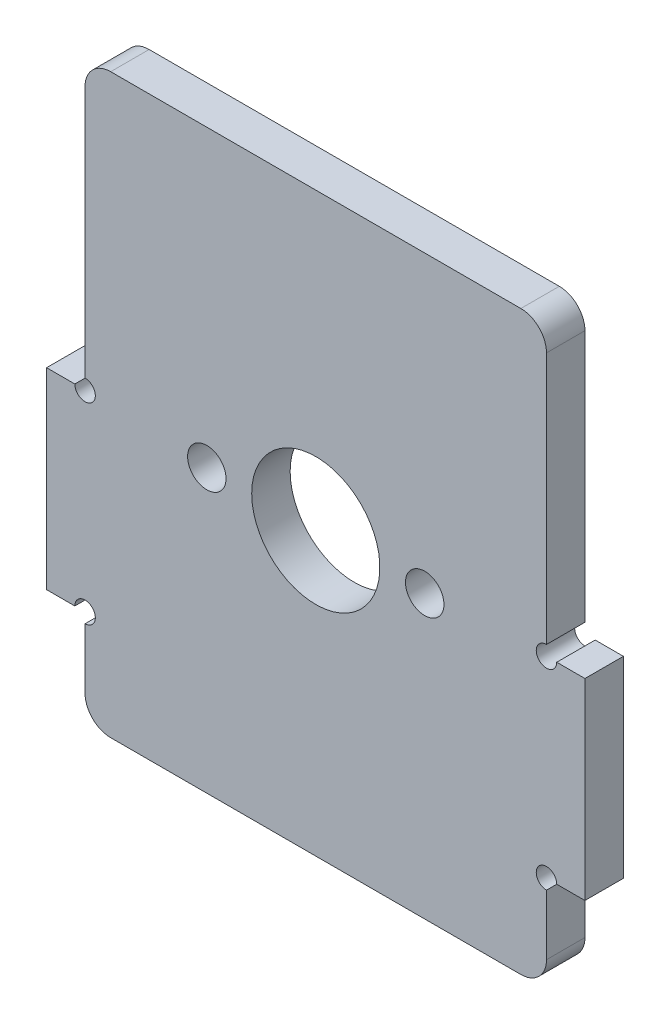
ISO-10303-21;
HEADER;
FILE_DESCRIPTION(('STEP AP214'),'2;1');
FILE_NAME('part.step','',(''),(''),'','','');
FILE_SCHEMA(('AUTOMOTIVE_DESIGN { 1 0 10303 214 1 1 1 1 }'));
ENDSEC;
DATA;
#1=APPLICATION_CONTEXT('core data for automotive mechanical design processes');
#2=APPLICATION_PROTOCOL_DEFINITION('international standard','automotive_design',2000,#1);
#3=PRODUCT_CONTEXT('',#1,'mechanical');
#4=PRODUCT('Part','Part','',(#3));
#5=PRODUCT_RELATED_PRODUCT_CATEGORY('part','',(#4));
#6=PRODUCT_DEFINITION_FORMATION('','',#4);
#7=PRODUCT_DEFINITION_CONTEXT('part definition',#1,'design');
#8=PRODUCT_DEFINITION('design','',#6,#7);
#9=PRODUCT_DEFINITION_SHAPE('','',#8);
#10=(LENGTH_UNIT() NAMED_UNIT(*) SI_UNIT(.MILLI.,.METRE.));
#11=(NAMED_UNIT(*) PLANE_ANGLE_UNIT() SI_UNIT($,.RADIAN.));
#12=(NAMED_UNIT(*) SI_UNIT($,.STERADIAN.) SOLID_ANGLE_UNIT());
#13=UNCERTAINTY_MEASURE_WITH_UNIT(LENGTH_MEASURE(1.E-05),#10,'distance_accuracy_value','');
#14=(GEOMETRIC_REPRESENTATION_CONTEXT(3) GLOBAL_UNCERTAINTY_ASSIGNED_CONTEXT((#13)) GLOBAL_UNIT_ASSIGNED_CONTEXT((#10,
#11,#12)) REPRESENTATION_CONTEXT('',''));
#15=CARTESIAN_POINT('',(0.,0.,0.));
#16=DIRECTION('',(0.,0.,1.));
#17=DIRECTION('',(1.,0.,0.));
#18=AXIS2_PLACEMENT_3D('',#15,#16,#17);
#19=CARTESIAN_POINT('',(-18.,0.,3.));
#20=DIRECTION('',(-1.,0.,0.));
#21=DIRECTION('',(0.,-1.,0.));
#22=AXIS2_PLACEMENT_3D('',#19,#20,#21);
#23=PLANE('',#22);
#24=DIRECTION('',(0.,1.,0.));
#25=VECTOR('',#24,1.);
#26=CARTESIAN_POINT('',(-18.,0.,3.));
#27=LINE('',#26,#25);
#28=CARTESIAN_POINT('',(-18.,8.29999999999999,3.));
#29=VERTEX_POINT('',#28);
#30=CARTESIAN_POINT('',(-18.,28.,3.));
#31=VERTEX_POINT('',#30);
#32=EDGE_CURVE('E220',#29,#31,#27,.T.);
#33=ORIENTED_EDGE('',*,*,#32,.T.);
#34=DIRECTION('',(0.,0.,-1.));
#35=VECTOR('',#34,1.);
#36=CARTESIAN_POINT('',(-18.,28.,3.));
#37=LINE('',#36,#35);
#38=CARTESIAN_POINT('',(-18.,28.,0.));
#39=VERTEX_POINT('',#38);
#40=EDGE_CURVE('E353',#31,#39,#37,.T.);
#41=ORIENTED_EDGE('',*,*,#40,.T.);
#42=DIRECTION('',(0.,1.,0.));
#43=VECTOR('',#42,1.);
#44=CARTESIAN_POINT('',(-18.,0.,0.));
#45=LINE('',#44,#43);
#46=CARTESIAN_POINT('',(-18.,8.29999999999999,0.));
#47=VERTEX_POINT('',#46);
#48=EDGE_CURVE('E234',#47,#39,#45,.T.);
#49=ORIENTED_EDGE('',*,*,#48,.F.);
#50=DIRECTION('',(0.,0.,-1.));
#51=VECTOR('',#50,1.);
#52=CARTESIAN_POINT('',(-18.,8.29999999999999,3.));
#53=LINE('',#52,#51);
#54=EDGE_CURVE('E261',#29,#47,#53,.T.);
#55=ORIENTED_EDGE('',*,*,#54,.F.);
#56=EDGE_LOOP('',(#33,#41,#49,#55));
#57=FACE_BOUND('',#56,.T.);
#58=ADVANCED_FACE('F35',(#57),#23,.T.);
#59=CARTESIAN_POINT('',(0.,7.49999999999999,3.));
#60=DIRECTION('',(0.,1.,0.));
#61=DIRECTION('',(0.,0.,1.));
#62=AXIS2_PLACEMENT_3D('',#59,#60,#61);
#63=PLANE('',#62);
#64=DIRECTION('',(0.,0.,-1.));
#65=VECTOR('',#64,1.);
#66=CARTESIAN_POINT('',(-18.8,7.49999999999999,3.));
#67=LINE('',#66,#65);
#68=CARTESIAN_POINT('',(-18.8,7.49999999999999,0.));
#69=VERTEX_POINT('',#68);
#70=CARTESIAN_POINT('',(-18.8,7.49999999999999,3.));
#71=VERTEX_POINT('',#70);
#72=EDGE_CURVE('E263',#69,#71,#67,.F.);
#73=ORIENTED_EDGE('',*,*,#72,.F.);
#74=DIRECTION('',(1.,0.,0.));
#75=VECTOR('',#74,1.);
#76=CARTESIAN_POINT('',(0.,7.49999999999999,0.));
#77=LINE('',#76,#75);
#78=CARTESIAN_POINT('',(-21.,7.49999999999999,0.));
#79=VERTEX_POINT('',#78);
#80=EDGE_CURVE('E302',#79,#69,#77,.T.);
#81=ORIENTED_EDGE('',*,*,#80,.F.);
#82=DIRECTION('',(0.,0.,-1.));
#83=VECTOR('',#82,1.);
#84=CARTESIAN_POINT('',(-21.,7.49999999999999,3.));
#85=LINE('',#84,#83);
#86=CARTESIAN_POINT('',(-21.,7.49999999999999,3.));
#87=VERTEX_POINT('',#86);
#88=EDGE_CURVE('E320',#87,#79,#85,.T.);
#89=ORIENTED_EDGE('',*,*,#88,.F.);
#90=DIRECTION('',(1.,0.,0.));
#91=VECTOR('',#90,1.);
#92=CARTESIAN_POINT('',(0.,7.49999999999999,3.));
#93=LINE('',#92,#91);
#94=EDGE_CURVE('E227',#87,#71,#93,.T.);
#95=ORIENTED_EDGE('',*,*,#94,.T.);
#96=EDGE_LOOP('',(#73,#81,#89,#95));
#97=FACE_BOUND('',#96,.T.);
#98=ADVANCED_FACE('F390',(#97),#63,.T.);
#99=CARTESIAN_POINT('',(-21.,0.,3.));
#100=DIRECTION('',(-1.,0.,0.));
#101=DIRECTION('',(0.,0.,1.));
#102=AXIS2_PLACEMENT_3D('',#99,#100,#101);
#103=PLANE('',#102);
#104=DIRECTION('',(0.,1.,0.));
#105=VECTOR('',#104,1.);
#106=CARTESIAN_POINT('',(-21.,0.,0.));
#107=LINE('',#106,#105);
#108=CARTESIAN_POINT('',(-21.,-7.50000000000001,0.));
#109=VERTEX_POINT('',#108);
#110=EDGE_CURVE('E298',#109,#79,#107,.T.);
#111=ORIENTED_EDGE('',*,*,#110,.F.);
#112=DIRECTION('',(0.,0.,-1.));
#113=VECTOR('',#112,1.);
#114=CARTESIAN_POINT('',(-21.,-7.50000000000001,3.));
#115=LINE('',#114,#113);
#116=CARTESIAN_POINT('',(-21.,-7.50000000000001,3.));
#117=VERTEX_POINT('',#116);
#118=EDGE_CURVE('E293',#117,#109,#115,.T.);
#119=ORIENTED_EDGE('',*,*,#118,.F.);
#120=DIRECTION('',(0.,1.,0.));
#121=VECTOR('',#120,1.);
#122=CARTESIAN_POINT('',(-21.,0.,3.));
#123=LINE('',#122,#121);
#124=EDGE_CURVE('E224',#117,#87,#123,.T.);
#125=ORIENTED_EDGE('',*,*,#124,.T.);
#126=ORIENTED_EDGE('',*,*,#88,.T.);
#127=EDGE_LOOP('',(#111,#119,#125,#126));
#128=FACE_BOUND('',#127,.T.);
#129=ADVANCED_FACE('F398',(#128),#103,.T.);
#130=CARTESIAN_POINT('',(0.,-7.50000000000001,3.));
#131=DIRECTION('',(0.,1.,0.));
#132=DIRECTION('',(0.,0.,1.));
#133=AXIS2_PLACEMENT_3D('',#130,#131,#132);
#134=PLANE('',#133);
#135=DIRECTION('',(1.,0.,0.));
#136=VECTOR('',#135,1.);
#137=CARTESIAN_POINT('',(0.,-7.50000000000001,0.));
#138=LINE('',#137,#136);
#139=CARTESIAN_POINT('',(-18.8,-7.50000000000001,0.));
#140=VERTEX_POINT('',#139);
#141=EDGE_CURVE('E292',#109,#140,#138,.T.);
#142=ORIENTED_EDGE('',*,*,#141,.T.);
#143=DIRECTION('',(0.,0.,-1.));
#144=VECTOR('',#143,1.);
#145=CARTESIAN_POINT('',(-18.8,-7.50000000000001,3.));
#146=LINE('',#145,#144);
#147=CARTESIAN_POINT('',(-18.8,-7.50000000000001,3.));
#148=VERTEX_POINT('',#147);
#149=EDGE_CURVE('E265',#140,#148,#146,.F.);
#150=ORIENTED_EDGE('',*,*,#149,.T.);
#151=DIRECTION('',(1.,0.,0.));
#152=VECTOR('',#151,1.);
#153=CARTESIAN_POINT('',(0.,-7.50000000000001,3.));
#154=LINE('',#153,#152);
#155=EDGE_CURVE('E218',#117,#148,#154,.T.);
#156=ORIENTED_EDGE('',*,*,#155,.F.);
#157=ORIENTED_EDGE('',*,*,#118,.T.);
#158=EDGE_LOOP('',(#142,#150,#156,#157));
#159=FACE_BOUND('',#158,.T.);
#160=ADVANCED_FACE('F290',(#159),#134,.F.);
#161=CARTESIAN_POINT('',(-18.,-13.,0.));
#162=VERTEX_POINT('',#161);
#163=CARTESIAN_POINT('',(-18.,-8.30000000000001,0.));
#164=VERTEX_POINT('',#163);
#165=EDGE_CURVE('E297',#162,#164,#45,.T.);
#166=ORIENTED_EDGE('',*,*,#165,.F.);
#167=DIRECTION('',(0.,0.,-1.));
#168=VECTOR('',#167,1.);
#169=CARTESIAN_POINT('',(-18.,-13.,3.));
#170=LINE('',#169,#168);
#171=CARTESIAN_POINT('',(-18.,-13.,3.));
#172=VERTEX_POINT('',#171);
#173=EDGE_CURVE('E50',#162,#172,#170,.F.);
#174=ORIENTED_EDGE('',*,*,#173,.T.);
#175=CARTESIAN_POINT('',(-18.,-8.30000000000001,3.));
#176=VERTEX_POINT('',#175);
#177=EDGE_CURVE('E215',#172,#176,#27,.T.);
#178=ORIENTED_EDGE('',*,*,#177,.T.);
#179=DIRECTION('',(0.,0.,-1.));
#180=VECTOR('',#179,1.);
#181=CARTESIAN_POINT('',(-18.,-8.30000000000001,3.));
#182=LINE('',#181,#180);
#183=EDGE_CURVE('E268',#164,#176,#182,.F.);
#184=ORIENTED_EDGE('',*,*,#183,.F.);
#185=EDGE_LOOP('',(#166,#174,#178,#184));
#186=FACE_BOUND('',#185,.T.);
#187=ADVANCED_FACE('F392',(#186),#23,.T.);
#188=CARTESIAN_POINT('',(0.,-15.,3.));
#189=DIRECTION('',(0.,1.,0.));
#190=DIRECTION('',(0.,0.,1.));
#191=AXIS2_PLACEMENT_3D('',#188,#189,#190);
#192=PLANE('',#191);
#193=DIRECTION('',(1.,0.,0.));
#194=VECTOR('',#193,1.);
#195=CARTESIAN_POINT('',(0.,-15.,0.));
#196=LINE('',#195,#194);
#197=CARTESIAN_POINT('',(-16.,-15.,0.));
#198=VERTEX_POINT('',#197);
#199=CARTESIAN_POINT('',(16.,-15.,0.));
#200=VERTEX_POINT('',#199);
#201=EDGE_CURVE('E300',#198,#200,#196,.T.);
#202=ORIENTED_EDGE('',*,*,#201,.T.);
#203=DIRECTION('',(0.,0.,-1.));
#204=VECTOR('',#203,1.);
#205=CARTESIAN_POINT('',(16.,-15.,3.));
#206=LINE('',#205,#204);
#207=CARTESIAN_POINT('',(16.,-15.,3.));
#208=VERTEX_POINT('',#207);
#209=EDGE_CURVE('E343',#200,#208,#206,.F.);
#210=ORIENTED_EDGE('',*,*,#209,.T.);
#211=DIRECTION('',(1.,0.,0.));
#212=VECTOR('',#211,1.);
#213=CARTESIAN_POINT('',(0.,-15.,3.));
#214=LINE('',#213,#212);
#215=CARTESIAN_POINT('',(-16.,-15.,3.));
#216=VERTEX_POINT('',#215);
#217=EDGE_CURVE('E210',#216,#208,#214,.T.);
#218=ORIENTED_EDGE('',*,*,#217,.F.);
#219=DIRECTION('',(0.,0.,-1.));
#220=VECTOR('',#219,1.);
#221=CARTESIAN_POINT('',(-16.,-15.,0.));
#222=LINE('',#221,#220);
#223=EDGE_CURVE('E340',#216,#198,#222,.T.);
#224=ORIENTED_EDGE('',*,*,#223,.T.);
#225=EDGE_LOOP('',(#202,#210,#218,#224));
#226=FACE_BOUND('',#225,.T.);
#227=ADVANCED_FACE('F403',(#226),#192,.F.);
#228=CARTESIAN_POINT('',(18.,0.,3.));
#229=DIRECTION('',(-1.,0.,0.));
#230=DIRECTION('',(0.,-1.,0.));
#231=AXIS2_PLACEMENT_3D('',#228,#229,#230);
#232=PLANE('',#231);
#233=DIRECTION('',(0.,1.,0.));
#234=VECTOR('',#233,1.);
#235=CARTESIAN_POINT('',(18.,0.,3.));
#236=LINE('',#235,#234);
#237=CARTESIAN_POINT('',(18.,-13.,3.));
#238=VERTEX_POINT('',#237);
#239=CARTESIAN_POINT('',(18.,-8.30000000000001,3.));
#240=VERTEX_POINT('',#239);
#241=EDGE_CURVE('E201',#238,#240,#236,.T.);
#242=ORIENTED_EDGE('',*,*,#241,.F.);
#243=DIRECTION('',(0.,0.,-1.));
#244=VECTOR('',#243,1.);
#245=CARTESIAN_POINT('',(18.,-13.,3.));
#246=LINE('',#245,#244);
#247=CARTESIAN_POINT('',(18.,-13.,0.));
#248=VERTEX_POINT('',#247);
#249=EDGE_CURVE('E329',#238,#248,#246,.T.);
#250=ORIENTED_EDGE('',*,*,#249,.T.);
#251=DIRECTION('',(0.,1.,0.));
#252=VECTOR('',#251,1.);
#253=CARTESIAN_POINT('',(18.,0.,0.));
#254=LINE('',#253,#252);
#255=CARTESIAN_POINT('',(18.,-8.30000000000001,0.));
#256=VERTEX_POINT('',#255);
#257=EDGE_CURVE('E308',#248,#256,#254,.T.);
#258=ORIENTED_EDGE('',*,*,#257,.T.);
#259=DIRECTION('',(0.,0.,-1.));
#260=VECTOR('',#259,1.);
#261=CARTESIAN_POINT('',(18.,-8.30000000000001,3.));
#262=LINE('',#261,#260);
#263=EDGE_CURVE('E243',#256,#240,#262,.F.);
#264=ORIENTED_EDGE('',*,*,#263,.T.);
#265=EDGE_LOOP('',(#242,#250,#258,#264));
#266=FACE_BOUND('',#265,.T.);
#267=ADVANCED_FACE('F407',(#266),#232,.F.);
#268=CARTESIAN_POINT('',(0.,-7.50000000000001,3.));
#269=DIRECTION('',(0.,-1.,0.));
#270=DIRECTION('',(0.,0.,-1.));
#271=AXIS2_PLACEMENT_3D('',#268,#269,#270);
#272=PLANE('',#271);
#273=DIRECTION('',(0.,0.,-1.));
#274=VECTOR('',#273,1.);
#275=CARTESIAN_POINT('',(18.8,-7.50000000000001,3.));
#276=LINE('',#275,#274);
#277=CARTESIAN_POINT('',(18.8,-7.50000000000001,0.));
#278=VERTEX_POINT('',#277);
#279=CARTESIAN_POINT('',(18.8,-7.50000000000001,3.));
#280=VERTEX_POINT('',#279);
#281=EDGE_CURVE('E259',#278,#280,#276,.F.);
#282=ORIENTED_EDGE('',*,*,#281,.F.);
#283=DIRECTION('',(-1.,0.,0.));
#284=VECTOR('',#283,1.);
#285=CARTESIAN_POINT('',(0.,-7.50000000000001,0.));
#286=LINE('',#285,#284);
#287=CARTESIAN_POINT('',(21.,-7.50000000000001,0.));
#288=VERTEX_POINT('',#287);
#289=EDGE_CURVE('E310',#288,#278,#286,.T.);
#290=ORIENTED_EDGE('',*,*,#289,.F.);
#291=DIRECTION('',(0.,0.,-1.));
#292=VECTOR('',#291,1.);
#293=CARTESIAN_POINT('',(21.,-7.50000000000001,3.));
#294=LINE('',#293,#292);
#295=CARTESIAN_POINT('',(21.,-7.50000000000001,3.));
#296=VERTEX_POINT('',#295);
#297=EDGE_CURVE('E203',#296,#288,#294,.T.);
#298=ORIENTED_EDGE('',*,*,#297,.F.);
#299=DIRECTION('',(-1.,0.,0.));
#300=VECTOR('',#299,1.);
#301=CARTESIAN_POINT('',(0.,-7.50000000000001,3.));
#302=LINE('',#301,#300);
#303=EDGE_CURVE('E209',#296,#280,#302,.T.);
#304=ORIENTED_EDGE('',*,*,#303,.T.);
#305=EDGE_LOOP('',(#282,#290,#298,#304));
#306=FACE_BOUND('',#305,.T.);
#307=ADVANCED_FACE('F424',(#306),#272,.T.);
#308=CARTESIAN_POINT('',(21.,0.,3.));
#309=DIRECTION('',(-1.,0.,0.));
#310=DIRECTION('',(0.,0.,1.));
#311=AXIS2_PLACEMENT_3D('',#308,#309,#310);
#312=PLANE('',#311);
#313=DIRECTION('',(0.,1.,0.));
#314=VECTOR('',#313,1.);
#315=CARTESIAN_POINT('',(21.,0.,0.));
#316=LINE('',#315,#314);
#317=CARTESIAN_POINT('',(21.,7.49999999999999,0.));
#318=VERTEX_POINT('',#317);
#319=EDGE_CURVE('E313',#288,#318,#316,.T.);
#320=ORIENTED_EDGE('',*,*,#319,.T.);
#321=DIRECTION('',(0.,0.,-1.));
#322=VECTOR('',#321,1.);
#323=CARTESIAN_POINT('',(21.,7.49999999999999,3.));
#324=LINE('',#323,#322);
#325=CARTESIAN_POINT('',(21.,7.49999999999999,3.));
#326=VERTEX_POINT('',#325);
#327=EDGE_CURVE('E199',#326,#318,#324,.T.);
#328=ORIENTED_EDGE('',*,*,#327,.F.);
#329=DIRECTION('',(0.,1.,0.));
#330=VECTOR('',#329,1.);
#331=CARTESIAN_POINT('',(21.,0.,3.));
#332=LINE('',#331,#330);
#333=EDGE_CURVE('E205',#296,#326,#332,.T.);
#334=ORIENTED_EDGE('',*,*,#333,.F.);
#335=ORIENTED_EDGE('',*,*,#297,.T.);
#336=EDGE_LOOP('',(#320,#328,#334,#335));
#337=FACE_BOUND('',#336,.T.);
#338=ADVANCED_FACE('F378',(#337),#312,.F.);
#339=CARTESIAN_POINT('',(0.,7.49999999999999,3.));
#340=DIRECTION('',(0.,-1.,0.));
#341=DIRECTION('',(0.,0.,-1.));
#342=AXIS2_PLACEMENT_3D('',#339,#340,#341);
#343=PLANE('',#342);
#344=DIRECTION('',(-1.,0.,0.));
#345=VECTOR('',#344,1.);
#346=CARTESIAN_POINT('',(0.,7.49999999999999,0.));
#347=LINE('',#346,#345);
#348=CARTESIAN_POINT('',(18.8,7.49999999999999,0.));
#349=VERTEX_POINT('',#348);
#350=EDGE_CURVE('E315',#318,#349,#347,.T.);
#351=ORIENTED_EDGE('',*,*,#350,.T.);
#352=DIRECTION('',(0.,0.,-1.));
#353=VECTOR('',#352,1.);
#354=CARTESIAN_POINT('',(18.8,7.49999999999999,3.));
#355=LINE('',#354,#353);
#356=CARTESIAN_POINT('',(18.8,7.49999999999999,3.));
#357=VERTEX_POINT('',#356);
#358=EDGE_CURVE('E184',#349,#357,#355,.F.);
#359=ORIENTED_EDGE('',*,*,#358,.T.);
#360=DIRECTION('',(-1.,0.,0.));
#361=VECTOR('',#360,1.);
#362=CARTESIAN_POINT('',(0.,7.49999999999999,3.));
#363=LINE('',#362,#361);
#364=EDGE_CURVE('E194',#326,#357,#363,.T.);
#365=ORIENTED_EDGE('',*,*,#364,.F.);
#366=ORIENTED_EDGE('',*,*,#327,.T.);
#367=EDGE_LOOP('',(#351,#359,#365,#366));
#368=FACE_BOUND('',#367,.T.);
#369=ADVANCED_FACE('F382',(#368),#343,.F.);
#370=CARTESIAN_POINT('',(18.,8.29999999999999,0.));
#371=VERTEX_POINT('',#370);
#372=CARTESIAN_POINT('',(18.,28.,0.));
#373=VERTEX_POINT('',#372);
#374=EDGE_CURVE('E230',#371,#373,#254,.T.);
#375=ORIENTED_EDGE('',*,*,#374,.T.);
#376=DIRECTION('',(0.,0.,-1.));
#377=VECTOR('',#376,1.);
#378=CARTESIAN_POINT('',(18.,28.,3.));
#379=LINE('',#378,#377);
#380=CARTESIAN_POINT('',(18.,28.,3.));
#381=VERTEX_POINT('',#380);
#382=EDGE_CURVE('E11',#373,#381,#379,.F.);
#383=ORIENTED_EDGE('',*,*,#382,.T.);
#384=CARTESIAN_POINT('',(18.,8.29999999999999,3.));
#385=VERTEX_POINT('',#384);
#386=EDGE_CURVE('E191',#385,#381,#236,.T.);
#387=ORIENTED_EDGE('',*,*,#386,.F.);
#388=DIRECTION('',(0.,0.,-1.));
#389=VECTOR('',#388,1.);
#390=CARTESIAN_POINT('',(18.,8.29999999999999,3.));
#391=LINE('',#390,#389);
#392=EDGE_CURVE('E173',#385,#371,#391,.T.);
#393=ORIENTED_EDGE('',*,*,#392,.T.);
#394=EDGE_LOOP('',(#375,#383,#387,#393));
#395=FACE_BOUND('',#394,.T.);
#396=ADVANCED_FACE('F197',(#395),#232,.F.);
#397=CARTESIAN_POINT('',(0.,0.,3.));
#398=DIRECTION('',(0.,0.,1.));
#399=DIRECTION('',(1.,0.,0.));
#400=AXIS2_PLACEMENT_3D('',#397,#398,#399);
#401=PLANE('',#400);
#402=ORIENTED_EDGE('',*,*,#217,.T.);
#403=CARTESIAN_POINT('',(16.,-13.,3.));
#404=DIRECTION('',(0.,0.,1.));
#405=DIRECTION('',(1.,0.,0.));
#406=AXIS2_PLACEMENT_3D('',#403,#404,#405);
#407=CIRCLE('',#406,2.);
#408=EDGE_CURVE('E350',#208,#238,#407,.T.);
#409=ORIENTED_EDGE('',*,*,#408,.T.);
#410=ORIENTED_EDGE('',*,*,#241,.T.);
#411=CARTESIAN_POINT('',(18.,-7.50000000000001,3.));
#412=DIRECTION('',(0.,0.,-1.));
#413=DIRECTION('',(-1.,0.,0.));
#414=AXIS2_PLACEMENT_3D('',#411,#412,#413);
#415=CIRCLE('',#414,0.799999999999999);
#416=EDGE_CURVE('E195',#240,#280,#415,.T.);
#417=ORIENTED_EDGE('',*,*,#416,.T.);
#418=ORIENTED_EDGE('',*,*,#303,.F.);
#419=ORIENTED_EDGE('',*,*,#333,.T.);
#420=ORIENTED_EDGE('',*,*,#364,.T.);
#421=CARTESIAN_POINT('',(18.,7.49999999999999,3.));
#422=DIRECTION('',(0.,0.,-1.));
#423=DIRECTION('',(-1.,0.,0.));
#424=AXIS2_PLACEMENT_3D('',#421,#422,#423);
#425=CIRCLE('',#424,0.799999999999999);
#426=EDGE_CURVE('E176',#357,#385,#425,.T.);
#427=ORIENTED_EDGE('',*,*,#426,.T.);
#428=ORIENTED_EDGE('',*,*,#386,.T.);
#429=CARTESIAN_POINT('',(16.,28.,3.));
#430=DIRECTION('',(0.,0.,1.));
#431=DIRECTION('',(1.,0.,0.));
#432=AXIS2_PLACEMENT_3D('',#429,#430,#431);
#433=CIRCLE('',#432,2.);
#434=CARTESIAN_POINT('',(16.,30.,3.));
#435=VERTEX_POINT('',#434);
#436=EDGE_CURVE('E345',#381,#435,#433,.T.);
#437=ORIENTED_EDGE('',*,*,#436,.T.);
#438=DIRECTION('',(1.,0.,0.));
#439=VECTOR('',#438,1.);
#440=CARTESIAN_POINT('',(18.,30.,3.));
#441=LINE('',#440,#439);
#442=CARTESIAN_POINT('',(-16.,30.,3.));
#443=VERTEX_POINT('',#442);
#444=EDGE_CURVE('E231',#443,#435,#441,.T.);
#445=ORIENTED_EDGE('',*,*,#444,.F.);
#446=CARTESIAN_POINT('',(-16.,28.,3.));
#447=DIRECTION('',(0.,0.,1.));
#448=DIRECTION('',(1.,0.,0.));
#449=AXIS2_PLACEMENT_3D('',#446,#447,#448);
#450=CIRCLE('',#449,2.);
#451=EDGE_CURVE('E58',#443,#31,#450,.T.);
#452=ORIENTED_EDGE('',*,*,#451,.T.);
#453=ORIENTED_EDGE('',*,*,#32,.F.);
#454=CARTESIAN_POINT('',(-18.,7.49999999999999,3.));
#455=DIRECTION('',(0.,0.,-1.));
#456=DIRECTION('',(-1.,0.,0.));
#457=AXIS2_PLACEMENT_3D('',#454,#455,#456);
#458=CIRCLE('',#457,0.799999999999999);
#459=EDGE_CURVE('E272',#29,#71,#458,.T.);
#460=ORIENTED_EDGE('',*,*,#459,.T.);
#461=ORIENTED_EDGE('',*,*,#94,.F.);
#462=ORIENTED_EDGE('',*,*,#124,.F.);
#463=ORIENTED_EDGE('',*,*,#155,.T.);
#464=CARTESIAN_POINT('',(-18.,-7.50000000000001,3.));
#465=DIRECTION('',(0.,0.,-1.));
#466=DIRECTION('',(-1.,0.,0.));
#467=AXIS2_PLACEMENT_3D('',#464,#465,#466);
#468=CIRCLE('',#467,0.799999999999999);
#469=EDGE_CURVE('E275',#148,#176,#468,.T.);
#470=ORIENTED_EDGE('',*,*,#469,.T.);
#471=ORIENTED_EDGE('',*,*,#177,.F.);
#472=CARTESIAN_POINT('',(-16.,-13.,3.));
#473=DIRECTION('',(0.,0.,1.));
#474=DIRECTION('',(1.,0.,0.));
#475=AXIS2_PLACEMENT_3D('',#472,#473,#474);
#476=CIRCLE('',#475,2.);
#477=EDGE_CURVE('E348',#172,#216,#476,.T.);
#478=ORIENTED_EDGE('',*,*,#477,.T.);
#479=EDGE_LOOP('',(#402,#409,#410,#417,#418,#419,#420,#427,#428,#437,#445,#452,#453,#460,#461,
#462,#463,#470,#471,#478));
#480=FACE_BOUND('',#479,.T.);
#481=CARTESIAN_POINT('',(8.5,7.00000000000002,3.));
#482=DIRECTION('',(0.,0.,-1.));
#483=DIRECTION('',(-1.,0.,0.));
#484=AXIS2_PLACEMENT_3D('',#481,#482,#483);
#485=CIRCLE('',#484,1.5);
#486=CARTESIAN_POINT('',(7.,7.00000000000002,3.));
#487=VERTEX_POINT('',#486);
#488=EDGE_CURVE('E238',#487,#487,#485,.T.);
#489=ORIENTED_EDGE('',*,*,#488,.T.);
#490=EDGE_LOOP('',(#489));
#491=FACE_BOUND('',#490,.T.);
#492=CARTESIAN_POINT('',(0.,7.00000000000002,3.));
#493=DIRECTION('',(0.,0.,-1.));
#494=DIRECTION('',(-1.,0.,0.));
#495=AXIS2_PLACEMENT_3D('',#492,#493,#494);
#496=CIRCLE('',#495,5.);
#497=CARTESIAN_POINT('',(-5.,7.00000000000002,3.));
#498=VERTEX_POINT('',#497);
#499=EDGE_CURVE('E249',#498,#498,#496,.T.);
#500=ORIENTED_EDGE('',*,*,#499,.T.);
#501=EDGE_LOOP('',(#500));
#502=FACE_BOUND('',#501,.T.);
#503=CARTESIAN_POINT('',(-8.5,7.00000000000002,3.));
#504=DIRECTION('',(0.,0.,-1.));
#505=DIRECTION('',(1.,0.,0.));
#506=AXIS2_PLACEMENT_3D('',#503,#504,#505);
#507=CIRCLE('',#506,1.5);
#508=CARTESIAN_POINT('',(-7.,7.00000000000002,3.));
#509=VERTEX_POINT('',#508);
#510=EDGE_CURVE('E242',#509,#509,#507,.T.);
#511=ORIENTED_EDGE('',*,*,#510,.T.);
#512=EDGE_LOOP('',(#511));
#513=FACE_BOUND('',#512,.T.);
#514=ADVANCED_FACE('F189',(#480,#491,#502,#513),#401,.T.);
#515=CARTESIAN_POINT('',(0.,0.,0.));
#516=DIRECTION('',(0.,0.,1.));
#517=DIRECTION('',(1.,0.,0.));
#518=AXIS2_PLACEMENT_3D('',#515,#516,#517);
#519=PLANE('',#518);
#520=CARTESIAN_POINT('',(8.5,7.00000000000002,0.));
#521=DIRECTION('',(0.,0.,-1.));
#522=DIRECTION('',(-1.,0.,0.));
#523=AXIS2_PLACEMENT_3D('',#520,#521,#522);
#524=CIRCLE('',#523,1.5);
#525=CARTESIAN_POINT('',(7.,7.00000000000002,0.));
#526=VERTEX_POINT('',#525);
#527=EDGE_CURVE('E252',#526,#526,#524,.T.);
#528=ORIENTED_EDGE('',*,*,#527,.F.);
#529=EDGE_LOOP('',(#528));
#530=FACE_BOUND('',#529,.T.);
#531=CARTESIAN_POINT('',(0.,7.00000000000002,0.));
#532=DIRECTION('',(0.,0.,-1.));
#533=DIRECTION('',(-1.,0.,0.));
#534=AXIS2_PLACEMENT_3D('',#531,#532,#533);
#535=CIRCLE('',#534,5.);
#536=CARTESIAN_POINT('',(-5.,7.00000000000002,0.));
#537=VERTEX_POINT('',#536);
#538=EDGE_CURVE('E246',#537,#537,#535,.T.);
#539=ORIENTED_EDGE('',*,*,#538,.F.);
#540=EDGE_LOOP('',(#539));
#541=FACE_BOUND('',#540,.T.);
#542=CARTESIAN_POINT('',(-8.5,7.00000000000002,0.));
#543=DIRECTION('',(0.,0.,-1.));
#544=DIRECTION('',(1.,0.,0.));
#545=AXIS2_PLACEMENT_3D('',#542,#543,#544);
#546=CIRCLE('',#545,1.5);
#547=CARTESIAN_POINT('',(-7.,7.00000000000002,0.));
#548=VERTEX_POINT('',#547);
#549=EDGE_CURVE('E239',#548,#548,#546,.T.);
#550=ORIENTED_EDGE('',*,*,#549,.F.);
#551=EDGE_LOOP('',(#550));
#552=FACE_BOUND('',#551,.T.);
#553=ORIENTED_EDGE('',*,*,#257,.F.);
#554=CARTESIAN_POINT('',(16.,-13.,0.));
#555=DIRECTION('',(0.,0.,1.));
#556=DIRECTION('',(1.,0.,0.));
#557=AXIS2_PLACEMENT_3D('',#554,#555,#556);
#558=CIRCLE('',#557,2.);
#559=EDGE_CURVE('E338',#248,#200,#558,.F.);
#560=ORIENTED_EDGE('',*,*,#559,.T.);
#561=ORIENTED_EDGE('',*,*,#201,.F.);
#562=CARTESIAN_POINT('',(-16.,-13.,0.));
#563=DIRECTION('',(0.,0.,1.));
#564=DIRECTION('',(1.,0.,0.));
#565=AXIS2_PLACEMENT_3D('',#562,#563,#564);
#566=CIRCLE('',#565,2.);
#567=EDGE_CURVE('E336',#198,#162,#566,.F.);
#568=ORIENTED_EDGE('',*,*,#567,.T.);
#569=ORIENTED_EDGE('',*,*,#165,.T.);
#570=CARTESIAN_POINT('',(-18.,-7.50000000000001,0.));
#571=DIRECTION('',(0.,0.,-1.));
#572=DIRECTION('',(-1.,0.,0.));
#573=AXIS2_PLACEMENT_3D('',#570,#571,#572);
#574=CIRCLE('',#573,0.799999999999999);
#575=EDGE_CURVE('E277',#140,#164,#574,.T.);
#576=ORIENTED_EDGE('',*,*,#575,.F.);
#577=ORIENTED_EDGE('',*,*,#141,.F.);
#578=ORIENTED_EDGE('',*,*,#110,.T.);
#579=ORIENTED_EDGE('',*,*,#80,.T.);
#580=CARTESIAN_POINT('',(-18.,7.49999999999999,0.));
#581=DIRECTION('',(0.,0.,1.));
#582=DIRECTION('',(1.,0.,0.));
#583=AXIS2_PLACEMENT_3D('',#580,#581,#582);
#584=CIRCLE('',#583,0.799999999999999);
#585=EDGE_CURVE('E323',#69,#47,#584,.T.);
#586=ORIENTED_EDGE('',*,*,#585,.T.);
#587=ORIENTED_EDGE('',*,*,#48,.T.);
#588=CARTESIAN_POINT('',(-16.,28.,0.));
#589=DIRECTION('',(0.,0.,1.));
#590=DIRECTION('',(1.,0.,0.));
#591=AXIS2_PLACEMENT_3D('',#588,#589,#590);
#592=CIRCLE('',#591,2.);
#593=CARTESIAN_POINT('',(-16.,30.,0.));
#594=VERTEX_POINT('',#593);
#595=EDGE_CURVE('E334',#39,#594,#592,.F.);
#596=ORIENTED_EDGE('',*,*,#595,.T.);
#597=DIRECTION('',(1.,0.,0.));
#598=VECTOR('',#597,1.);
#599=CARTESIAN_POINT('',(18.,30.,0.));
#600=LINE('',#599,#598);
#601=CARTESIAN_POINT('',(16.,30.,0.));
#602=VERTEX_POINT('',#601);
#603=EDGE_CURVE('E235',#594,#602,#600,.T.);
#604=ORIENTED_EDGE('',*,*,#603,.T.);
#605=CARTESIAN_POINT('',(16.,28.,0.));
#606=DIRECTION('',(0.,0.,1.));
#607=DIRECTION('',(1.,0.,0.));
#608=AXIS2_PLACEMENT_3D('',#605,#606,#607);
#609=CIRCLE('',#608,2.);
#610=EDGE_CURVE('E332',#602,#373,#609,.F.);
#611=ORIENTED_EDGE('',*,*,#610,.T.);
#612=ORIENTED_EDGE('',*,*,#374,.F.);
#613=CARTESIAN_POINT('',(18.,7.49999999999999,0.));
#614=DIRECTION('',(0.,0.,1.));
#615=DIRECTION('',(1.,0.,0.));
#616=AXIS2_PLACEMENT_3D('',#613,#614,#615);
#617=CIRCLE('',#616,0.799999999999999);
#618=EDGE_CURVE('E179',#371,#349,#617,.T.);
#619=ORIENTED_EDGE('',*,*,#618,.T.);
#620=ORIENTED_EDGE('',*,*,#350,.F.);
#621=ORIENTED_EDGE('',*,*,#319,.F.);
#622=ORIENTED_EDGE('',*,*,#289,.T.);
#623=CARTESIAN_POINT('',(18.,-7.50000000000001,0.));
#624=DIRECTION('',(0.,0.,1.));
#625=DIRECTION('',(1.,0.,0.));
#626=AXIS2_PLACEMENT_3D('',#623,#624,#625);
#627=CIRCLE('',#626,0.799999999999999);
#628=EDGE_CURVE('E326',#278,#256,#627,.T.);
#629=ORIENTED_EDGE('',*,*,#628,.T.);
#630=EDGE_LOOP('',(#553,#560,#561,#568,#569,#576,#577,#578,#579,#586,#587,#596,#604,#611,#612,
#619,#620,#621,#622,#629));
#631=FACE_BOUND('',#630,.T.);
#632=ADVANCED_FACE('F371',(#530,#541,#552,#631),#519,.F.);
#633=CARTESIAN_POINT('',(18.,30.,42.));
#634=DIRECTION('',(0.,1.,0.));
#635=DIRECTION('',(0.,0.,1.));
#636=AXIS2_PLACEMENT_3D('',#633,#634,#635);
#637=PLANE('',#636);
#638=ORIENTED_EDGE('',*,*,#603,.F.);
#639=DIRECTION('',(0.,0.,-1.));
#640=VECTOR('',#639,1.);
#641=CARTESIAN_POINT('',(-16.,30.,42.));
#642=LINE('',#641,#640);
#643=EDGE_CURVE('E43',#594,#443,#642,.F.);
#644=ORIENTED_EDGE('',*,*,#643,.T.);
#645=ORIENTED_EDGE('',*,*,#444,.T.);
#646=DIRECTION('',(0.,0.,-1.));
#647=VECTOR('',#646,1.);
#648=CARTESIAN_POINT('',(16.,30.,0.));
#649=LINE('',#648,#647);
#650=EDGE_CURVE('E356',#435,#602,#649,.T.);
#651=ORIENTED_EDGE('',*,*,#650,.T.);
#652=EDGE_LOOP('',(#638,#644,#645,#651));
#653=FACE_BOUND('',#652,.T.);
#654=ADVANCED_FACE('F361',(#653),#637,.T.);
#655=CARTESIAN_POINT('',(-8.5,7.00000000000002,3.));
#656=DIRECTION('',(0.,0.,-1.));
#657=DIRECTION('',(-1.,0.,0.));
#658=AXIS2_PLACEMENT_3D('',#655,#656,#657);
#659=CYLINDRICAL_SURFACE('',#658,1.5);
#660=ORIENTED_EDGE('',*,*,#510,.F.);
#661=EDGE_LOOP('',(#660));
#662=FACE_BOUND('',#661,.T.);
#663=ORIENTED_EDGE('',*,*,#549,.T.);
#664=EDGE_LOOP('',(#663));
#665=FACE_BOUND('',#664,.T.);
#666=ADVANCED_FACE('F444',(#662,#665),#659,.F.);
#667=CARTESIAN_POINT('',(0.,7.00000000000002,3.));
#668=DIRECTION('',(0.,0.,-1.));
#669=DIRECTION('',(-1.,0.,0.));
#670=AXIS2_PLACEMENT_3D('',#667,#668,#669);
#671=CYLINDRICAL_SURFACE('',#670,5.);
#672=ORIENTED_EDGE('',*,*,#499,.F.);
#673=EDGE_LOOP('',(#672));
#674=FACE_BOUND('',#673,.T.);
#675=ORIENTED_EDGE('',*,*,#538,.T.);
#676=EDGE_LOOP('',(#675));
#677=FACE_BOUND('',#676,.T.);
#678=ADVANCED_FACE('F447',(#674,#677),#671,.F.);
#679=CARTESIAN_POINT('',(8.5,7.00000000000002,3.));
#680=DIRECTION('',(0.,0.,-1.));
#681=DIRECTION('',(-1.,0.,0.));
#682=AXIS2_PLACEMENT_3D('',#679,#680,#681);
#683=CYLINDRICAL_SURFACE('',#682,1.5);
#684=ORIENTED_EDGE('',*,*,#488,.F.);
#685=EDGE_LOOP('',(#684));
#686=FACE_BOUND('',#685,.T.);
#687=ORIENTED_EDGE('',*,*,#527,.T.);
#688=EDGE_LOOP('',(#687));
#689=FACE_BOUND('',#688,.T.);
#690=ADVANCED_FACE('F451',(#686,#689),#683,.F.);
#691=CARTESIAN_POINT('',(18.,7.49999999999999,3.));
#692=DIRECTION('',(0.,0.,-1.));
#693=DIRECTION('',(-1.,0.,0.));
#694=AXIS2_PLACEMENT_3D('',#691,#692,#693);
#695=CYLINDRICAL_SURFACE('',#694,0.799999999999999);
#696=ORIENTED_EDGE('',*,*,#618,.F.);
#697=ORIENTED_EDGE('',*,*,#392,.F.);
#698=ORIENTED_EDGE('',*,*,#426,.F.);
#699=ORIENTED_EDGE('',*,*,#358,.F.);
#700=EDGE_LOOP('',(#696,#697,#698,#699));
#701=FACE_BOUND('',#700,.T.);
#702=ADVANCED_FACE('F175',(#701),#695,.F.);
#703=CARTESIAN_POINT('',(-18.,-7.50000000000001,3.));
#704=DIRECTION('',(0.,0.,-1.));
#705=DIRECTION('',(-1.,0.,0.));
#706=AXIS2_PLACEMENT_3D('',#703,#704,#705);
#707=CYLINDRICAL_SURFACE('',#706,0.799999999999999);
#708=ORIENTED_EDGE('',*,*,#575,.T.);
#709=ORIENTED_EDGE('',*,*,#183,.T.);
#710=ORIENTED_EDGE('',*,*,#469,.F.);
#711=ORIENTED_EDGE('',*,*,#149,.F.);
#712=EDGE_LOOP('',(#708,#709,#710,#711));
#713=FACE_BOUND('',#712,.T.);
#714=ADVANCED_FACE('F285',(#713),#707,.F.);
#715=CARTESIAN_POINT('',(-18.,7.49999999999999,3.));
#716=DIRECTION('',(0.,0.,-1.));
#717=DIRECTION('',(-1.,0.,0.));
#718=AXIS2_PLACEMENT_3D('',#715,#716,#717);
#719=CYLINDRICAL_SURFACE('',#718,0.799999999999999);
#720=ORIENTED_EDGE('',*,*,#54,.T.);
#721=ORIENTED_EDGE('',*,*,#585,.F.);
#722=ORIENTED_EDGE('',*,*,#72,.T.);
#723=ORIENTED_EDGE('',*,*,#459,.F.);
#724=EDGE_LOOP('',(#720,#721,#722,#723));
#725=FACE_BOUND('',#724,.T.);
#726=ADVANCED_FACE('F458',(#725),#719,.F.);
#727=CARTESIAN_POINT('',(18.,-7.50000000000001,3.));
#728=DIRECTION('',(0.,0.,-1.));
#729=DIRECTION('',(-1.,0.,0.));
#730=AXIS2_PLACEMENT_3D('',#727,#728,#729);
#731=CYLINDRICAL_SURFACE('',#730,0.799999999999999);
#732=ORIENTED_EDGE('',*,*,#628,.F.);
#733=ORIENTED_EDGE('',*,*,#281,.T.);
#734=ORIENTED_EDGE('',*,*,#416,.F.);
#735=ORIENTED_EDGE('',*,*,#263,.F.);
#736=EDGE_LOOP('',(#732,#733,#734,#735));
#737=FACE_BOUND('',#736,.T.);
#738=ADVANCED_FACE('F420',(#737),#731,.F.);
#739=CARTESIAN_POINT('',(16.,-13.,3.));
#740=DIRECTION('',(0.,0.,-1.));
#741=DIRECTION('',(-1.,0.,0.));
#742=AXIS2_PLACEMENT_3D('',#739,#740,#741);
#743=CYLINDRICAL_SURFACE('',#742,2.);
#744=ORIENTED_EDGE('',*,*,#408,.F.);
#745=ORIENTED_EDGE('',*,*,#209,.F.);
#746=ORIENTED_EDGE('',*,*,#559,.F.);
#747=ORIENTED_EDGE('',*,*,#249,.F.);
#748=EDGE_LOOP('',(#744,#745,#746,#747));
#749=FACE_BOUND('',#748,.T.);
#750=ADVANCED_FACE('F415',(#749),#743,.T.);
#751=CARTESIAN_POINT('',(-16.,-13.,3.));
#752=DIRECTION('',(0.,0.,1.));
#753=DIRECTION('',(1.,0.,0.));
#754=AXIS2_PLACEMENT_3D('',#751,#752,#753);
#755=CYLINDRICAL_SURFACE('',#754,2.);
#756=ORIENTED_EDGE('',*,*,#477,.F.);
#757=ORIENTED_EDGE('',*,*,#173,.F.);
#758=ORIENTED_EDGE('',*,*,#567,.F.);
#759=ORIENTED_EDGE('',*,*,#223,.F.);
#760=EDGE_LOOP('',(#756,#757,#758,#759));
#761=FACE_BOUND('',#760,.T.);
#762=ADVANCED_FACE('F388',(#761),#755,.T.);
#763=CARTESIAN_POINT('',(-16.,28.,3.));
#764=DIRECTION('',(0.,0.,-1.));
#765=DIRECTION('',(-1.,0.,0.));
#766=AXIS2_PLACEMENT_3D('',#763,#764,#765);
#767=CYLINDRICAL_SURFACE('',#766,2.);
#768=ORIENTED_EDGE('',*,*,#451,.F.);
#769=ORIENTED_EDGE('',*,*,#643,.F.);
#770=ORIENTED_EDGE('',*,*,#595,.F.);
#771=ORIENTED_EDGE('',*,*,#40,.F.);
#772=EDGE_LOOP('',(#768,#769,#770,#771));
#773=FACE_BOUND('',#772,.T.);
#774=ADVANCED_FACE('F365',(#773),#767,.T.);
#775=CARTESIAN_POINT('',(16.,28.,42.));
#776=DIRECTION('',(0.,0.,1.));
#777=DIRECTION('',(1.,0.,0.));
#778=AXIS2_PLACEMENT_3D('',#775,#776,#777);
#779=CYLINDRICAL_SURFACE('',#778,2.);
#780=ORIENTED_EDGE('',*,*,#436,.F.);
#781=ORIENTED_EDGE('',*,*,#382,.F.);
#782=ORIENTED_EDGE('',*,*,#610,.F.);
#783=ORIENTED_EDGE('',*,*,#650,.F.);
#784=EDGE_LOOP('',(#780,#781,#782,#783));
#785=FACE_BOUND('',#784,.T.);
#786=ADVANCED_FACE('F37',(#785),#779,.T.);
#787=CLOSED_SHELL('',(#58,#98,#129,#160,#187,#227,#267,#307,#338,#369,#396,#514,#632,#654,#666,
#678,#690,#702,#714,#726,#738,#750,#762,#774,#786));
#788=MANIFOLD_SOLID_BREP('B2',#787);
#789=ADVANCED_BREP_SHAPE_REPRESENTATION('',(#18,#788),#14);
#790=SHAPE_DEFINITION_REPRESENTATION(#9,#789);
ENDSEC;
END-ISO-10303-21;
